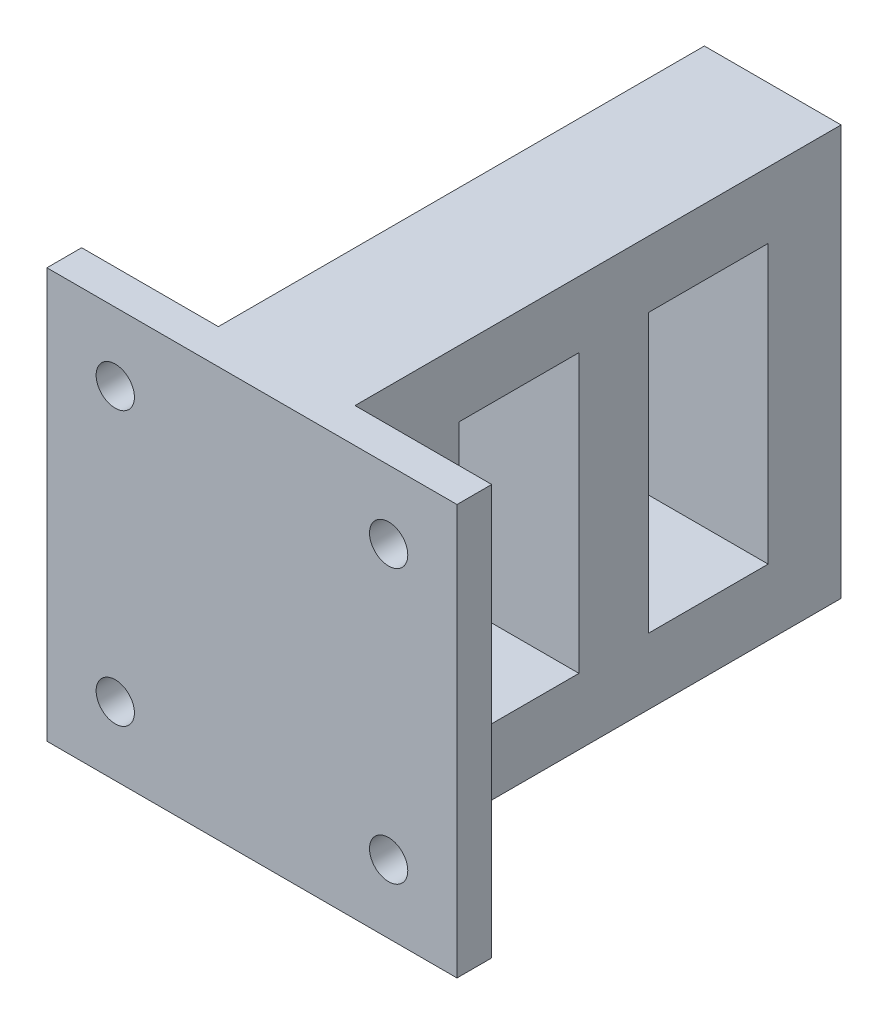
ISO-10303-21;
HEADER;
FILE_DESCRIPTION(('STEP AP214'),'2;1');
FILE_NAME('part.step','',(''),(''),'','','');
FILE_SCHEMA(('AUTOMOTIVE_DESIGN { 1 0 10303 214 1 1 1 1 }'));
ENDSEC;
DATA;
#1=APPLICATION_CONTEXT('core data for automotive mechanical design processes');
#2=APPLICATION_PROTOCOL_DEFINITION('international standard','automotive_design',2000,#1);
#3=PRODUCT_CONTEXT('',#1,'mechanical');
#4=PRODUCT('Part','Part','',(#3));
#5=PRODUCT_RELATED_PRODUCT_CATEGORY('part','',(#4));
#6=PRODUCT_DEFINITION_FORMATION('','',#4);
#7=PRODUCT_DEFINITION_CONTEXT('part definition',#1,'design');
#8=PRODUCT_DEFINITION('design','',#6,#7);
#9=PRODUCT_DEFINITION_SHAPE('','',#8);
#10=(LENGTH_UNIT() NAMED_UNIT(*) SI_UNIT(.MILLI.,.METRE.));
#11=(NAMED_UNIT(*) PLANE_ANGLE_UNIT() SI_UNIT($,.RADIAN.));
#12=(NAMED_UNIT(*) SI_UNIT($,.STERADIAN.) SOLID_ANGLE_UNIT());
#13=UNCERTAINTY_MEASURE_WITH_UNIT(LENGTH_MEASURE(1.E-05),#10,'distance_accuracy_value','');
#14=(GEOMETRIC_REPRESENTATION_CONTEXT(3) GLOBAL_UNCERTAINTY_ASSIGNED_CONTEXT((#13)) GLOBAL_UNIT_ASSIGNED_CONTEXT((#10,
#11,#12)) REPRESENTATION_CONTEXT('',''));
#15=CARTESIAN_POINT('',(0.,0.,0.));
#16=DIRECTION('',(0.,0.,1.));
#17=DIRECTION('',(1.,0.,0.));
#18=AXIS2_PLACEMENT_3D('',#15,#16,#17);
#19=CARTESIAN_POINT('',(0.,0.,0.));
#20=DIRECTION('',(0.,0.,-1.));
#21=DIRECTION('',(-1.,0.,0.));
#22=AXIS2_PLACEMENT_3D('',#19,#20,#21);
#23=PLANE('',#22);
#24=DIRECTION('',(0.,1.,0.));
#25=VECTOR('',#24,1.);
#26=CARTESIAN_POINT('',(10.,0.,0.));
#27=LINE('',#26,#25);
#28=CARTESIAN_POINT('',(10.,0.,0.));
#29=VERTEX_POINT('',#28);
#30=CARTESIAN_POINT('',(10.,30.,0.));
#31=VERTEX_POINT('',#30);
#32=EDGE_CURVE('E177',#29,#31,#27,.T.);
#33=ORIENTED_EDGE('',*,*,#32,.F.);
#34=DIRECTION('',(1.,0.,0.));
#35=VECTOR('',#34,1.);
#36=CARTESIAN_POINT('',(0.,0.,0.));
#37=LINE('',#36,#35);
#38=CARTESIAN_POINT('',(0.,0.,0.));
#39=VERTEX_POINT('',#38);
#40=EDGE_CURVE('E263',#39,#29,#37,.T.);
#41=ORIENTED_EDGE('',*,*,#40,.F.);
#42=DIRECTION('',(0.,-1.,0.));
#43=VECTOR('',#42,1.);
#44=CARTESIAN_POINT('',(0.,0.,0.));
#45=LINE('',#44,#43);
#46=CARTESIAN_POINT('',(0.,30.,0.));
#47=VERTEX_POINT('',#46);
#48=EDGE_CURVE('E246',#47,#39,#45,.T.);
#49=ORIENTED_EDGE('',*,*,#48,.F.);
#50=DIRECTION('',(-1.,0.,0.));
#51=VECTOR('',#50,1.);
#52=CARTESIAN_POINT('',(0.,30.,0.));
#53=LINE('',#52,#51);
#54=EDGE_CURVE('E268',#31,#47,#53,.T.);
#55=ORIENTED_EDGE('',*,*,#54,.F.);
#56=EDGE_LOOP('',(#33,#41,#49,#55));
#57=FACE_BOUND('',#56,.T.);
#58=CARTESIAN_POINT('',(5.,5.,0.));
#59=DIRECTION('',(0.,0.,1.));
#60=DIRECTION('',(1.,0.,0.));
#61=AXIS2_PLACEMENT_3D('',#58,#59,#60);
#62=CIRCLE('',#61,1.4);
#63=CARTESIAN_POINT('',(6.4,5.,0.));
#64=VERTEX_POINT('',#63);
#65=EDGE_CURVE('E240',#64,#64,#62,.T.);
#66=ORIENTED_EDGE('',*,*,#65,.T.);
#67=EDGE_LOOP('',(#66));
#68=FACE_BOUND('',#67,.T.);
#69=CARTESIAN_POINT('',(5.,25.,0.));
#70=DIRECTION('',(0.,0.,1.));
#71=DIRECTION('',(1.,0.,0.));
#72=AXIS2_PLACEMENT_3D('',#69,#70,#71);
#73=CIRCLE('',#72,1.4);
#74=CARTESIAN_POINT('',(6.4,25.,0.));
#75=VERTEX_POINT('',#74);
#76=EDGE_CURVE('E228',#75,#75,#73,.T.);
#77=ORIENTED_EDGE('',*,*,#76,.T.);
#78=EDGE_LOOP('',(#77));
#79=FACE_BOUND('',#78,.T.);
#80=ADVANCED_FACE('F33',(#57,#68,#79),#23,.T.);
#81=CARTESIAN_POINT('',(0.,0.,2.54));
#82=DIRECTION('',(0.,0.,-1.));
#83=DIRECTION('',(-1.,0.,0.));
#84=AXIS2_PLACEMENT_3D('',#81,#82,#83);
#85=PLANE('',#84);
#86=DIRECTION('',(0.,-1.,0.));
#87=VECTOR('',#86,1.);
#88=CARTESIAN_POINT('',(0.,0.,2.54));
#89=LINE('',#88,#87);
#90=CARTESIAN_POINT('',(0.,30.,2.54));
#91=VERTEX_POINT('',#90);
#92=CARTESIAN_POINT('',(0.,0.,2.54));
#93=VERTEX_POINT('',#92);
#94=EDGE_CURVE('E249',#91,#93,#89,.T.);
#95=ORIENTED_EDGE('',*,*,#94,.T.);
#96=DIRECTION('',(1.,0.,0.));
#97=VECTOR('',#96,1.);
#98=CARTESIAN_POINT('',(0.,0.,2.54));
#99=LINE('',#98,#97);
#100=CARTESIAN_POINT('',(30.,0.,2.54));
#101=VERTEX_POINT('',#100);
#102=EDGE_CURVE('E252',#93,#101,#99,.T.);
#103=ORIENTED_EDGE('',*,*,#102,.T.);
#104=DIRECTION('',(0.,1.,0.));
#105=VECTOR('',#104,1.);
#106=CARTESIAN_POINT('',(30.,0.,2.54));
#107=LINE('',#106,#105);
#108=CARTESIAN_POINT('',(30.,30.,2.54));
#109=VERTEX_POINT('',#108);
#110=EDGE_CURVE('E255',#101,#109,#107,.T.);
#111=ORIENTED_EDGE('',*,*,#110,.T.);
#112=DIRECTION('',(-1.,0.,0.));
#113=VECTOR('',#112,1.);
#114=CARTESIAN_POINT('',(0.,30.,2.54));
#115=LINE('',#114,#113);
#116=EDGE_CURVE('E257',#109,#91,#115,.T.);
#117=ORIENTED_EDGE('',*,*,#116,.T.);
#118=EDGE_LOOP('',(#95,#103,#111,#117));
#119=FACE_BOUND('',#118,.T.);
#120=CARTESIAN_POINT('',(5.,5.,2.54));
#121=DIRECTION('',(0.,0.,1.));
#122=DIRECTION('',(1.,0.,0.));
#123=AXIS2_PLACEMENT_3D('',#120,#121,#122);
#124=CIRCLE('',#123,1.4);
#125=CARTESIAN_POINT('',(6.4,5.,2.54));
#126=VERTEX_POINT('',#125);
#127=EDGE_CURVE('E243',#126,#126,#124,.T.);
#128=ORIENTED_EDGE('',*,*,#127,.F.);
#129=EDGE_LOOP('',(#128));
#130=FACE_BOUND('',#129,.T.);
#131=CARTESIAN_POINT('',(25.,5.,2.54));
#132=DIRECTION('',(0.,0.,1.));
#133=DIRECTION('',(1.,0.,0.));
#134=AXIS2_PLACEMENT_3D('',#131,#132,#133);
#135=CIRCLE('',#134,1.4);
#136=CARTESIAN_POINT('',(26.4,5.,2.54));
#137=VERTEX_POINT('',#136);
#138=EDGE_CURVE('E237',#137,#137,#135,.T.);
#139=ORIENTED_EDGE('',*,*,#138,.F.);
#140=EDGE_LOOP('',(#139));
#141=FACE_BOUND('',#140,.T.);
#142=CARTESIAN_POINT('',(5.,25.,2.54));
#143=DIRECTION('',(0.,0.,1.));
#144=DIRECTION('',(1.,0.,0.));
#145=AXIS2_PLACEMENT_3D('',#142,#143,#144);
#146=CIRCLE('',#145,1.4);
#147=CARTESIAN_POINT('',(6.4,25.,2.54));
#148=VERTEX_POINT('',#147);
#149=EDGE_CURVE('E231',#148,#148,#146,.T.);
#150=ORIENTED_EDGE('',*,*,#149,.F.);
#151=EDGE_LOOP('',(#150));
#152=FACE_BOUND('',#151,.T.);
#153=CARTESIAN_POINT('',(25.,25.,2.54));
#154=DIRECTION('',(0.,0.,1.));
#155=DIRECTION('',(1.,0.,0.));
#156=AXIS2_PLACEMENT_3D('',#153,#154,#155);
#157=CIRCLE('',#156,1.4);
#158=CARTESIAN_POINT('',(26.4,25.,2.54));
#159=VERTEX_POINT('',#158);
#160=EDGE_CURVE('E225',#159,#159,#157,.T.);
#161=ORIENTED_EDGE('',*,*,#160,.F.);
#162=EDGE_LOOP('',(#161));
#163=FACE_BOUND('',#162,.T.);
#164=ADVANCED_FACE('F318',(#119,#130,#141,#152,#163),#85,.F.);
#165=DIRECTION('',(0.,-1.,0.));
#166=VECTOR('',#165,1.);
#167=CARTESIAN_POINT('',(20.,0.,0.));
#168=LINE('',#167,#166);
#169=CARTESIAN_POINT('',(20.,30.,0.));
#170=VERTEX_POINT('',#169);
#171=CARTESIAN_POINT('',(20.,0.,0.));
#172=VERTEX_POINT('',#171);
#173=EDGE_CURVE('E202',#170,#172,#168,.T.);
#174=ORIENTED_EDGE('',*,*,#173,.F.);
#175=CARTESIAN_POINT('',(30.,30.,0.));
#176=VERTEX_POINT('',#175);
#177=EDGE_CURVE('E253',#176,#170,#53,.T.);
#178=ORIENTED_EDGE('',*,*,#177,.F.);
#179=DIRECTION('',(0.,1.,0.));
#180=VECTOR('',#179,1.);
#181=CARTESIAN_POINT('',(30.,0.,0.));
#182=LINE('',#181,#180);
#183=CARTESIAN_POINT('',(30.,0.,0.));
#184=VERTEX_POINT('',#183);
#185=EDGE_CURVE('E266',#184,#176,#182,.T.);
#186=ORIENTED_EDGE('',*,*,#185,.F.);
#187=EDGE_CURVE('E262',#172,#184,#37,.T.);
#188=ORIENTED_EDGE('',*,*,#187,.F.);
#189=EDGE_LOOP('',(#174,#178,#186,#188));
#190=FACE_BOUND('',#189,.T.);
#191=CARTESIAN_POINT('',(25.,5.,0.));
#192=DIRECTION('',(0.,0.,1.));
#193=DIRECTION('',(1.,0.,0.));
#194=AXIS2_PLACEMENT_3D('',#191,#192,#193);
#195=CIRCLE('',#194,1.4);
#196=CARTESIAN_POINT('',(26.4,5.,0.));
#197=VERTEX_POINT('',#196);
#198=EDGE_CURVE('E234',#197,#197,#195,.T.);
#199=ORIENTED_EDGE('',*,*,#198,.T.);
#200=EDGE_LOOP('',(#199));
#201=FACE_BOUND('',#200,.T.);
#202=CARTESIAN_POINT('',(25.,25.,0.));
#203=DIRECTION('',(0.,0.,1.));
#204=DIRECTION('',(1.,0.,0.));
#205=AXIS2_PLACEMENT_3D('',#202,#203,#204);
#206=CIRCLE('',#205,1.4);
#207=CARTESIAN_POINT('',(26.4,25.,0.));
#208=VERTEX_POINT('',#207);
#209=EDGE_CURVE('E224',#208,#208,#206,.T.);
#210=ORIENTED_EDGE('',*,*,#209,.T.);
#211=EDGE_LOOP('',(#210));
#212=FACE_BOUND('',#211,.T.);
#213=ADVANCED_FACE('F321',(#190,#201,#212),#23,.T.);
#214=CARTESIAN_POINT('',(0.,0.,2.54));
#215=DIRECTION('',(1.,0.,0.));
#216=DIRECTION('',(0.,0.,-1.));
#217=AXIS2_PLACEMENT_3D('',#214,#215,#216);
#218=PLANE('',#217);
#219=ORIENTED_EDGE('',*,*,#48,.T.);
#220=DIRECTION('',(0.,0.,-1.));
#221=VECTOR('',#220,1.);
#222=CARTESIAN_POINT('',(0.,0.,2.54));
#223=LINE('',#222,#221);
#224=EDGE_CURVE('E279',#93,#39,#223,.T.);
#225=ORIENTED_EDGE('',*,*,#224,.F.);
#226=ORIENTED_EDGE('',*,*,#94,.F.);
#227=DIRECTION('',(0.,0.,-1.));
#228=VECTOR('',#227,1.);
#229=CARTESIAN_POINT('',(0.,30.,2.54));
#230=LINE('',#229,#228);
#231=EDGE_CURVE('E259',#91,#47,#230,.T.);
#232=ORIENTED_EDGE('',*,*,#231,.T.);
#233=EDGE_LOOP('',(#219,#225,#226,#232));
#234=FACE_BOUND('',#233,.T.);
#235=ADVANCED_FACE('F35',(#234),#218,.F.);
#236=CARTESIAN_POINT('',(0.,0.,2.54));
#237=DIRECTION('',(0.,1.,0.));
#238=DIRECTION('',(0.,0.,1.));
#239=AXIS2_PLACEMENT_3D('',#236,#237,#238);
#240=PLANE('',#239);
#241=ORIENTED_EDGE('',*,*,#40,.T.);
#242=DIRECTION('',(0.,0.,1.));
#243=VECTOR('',#242,1.);
#244=CARTESIAN_POINT('',(10.,0.,-35.56));
#245=LINE('',#244,#243);
#246=CARTESIAN_POINT('',(10.,0.,-35.56));
#247=VERTEX_POINT('',#246);
#248=EDGE_CURVE('E208',#247,#29,#245,.T.);
#249=ORIENTED_EDGE('',*,*,#248,.F.);
#250=DIRECTION('',(-1.,0.,0.));
#251=VECTOR('',#250,1.);
#252=CARTESIAN_POINT('',(10.,0.,-35.56));
#253=LINE('',#252,#251);
#254=CARTESIAN_POINT('',(20.,0.,-35.56));
#255=VERTEX_POINT('',#254);
#256=EDGE_CURVE('E206',#255,#247,#253,.T.);
#257=ORIENTED_EDGE('',*,*,#256,.F.);
#258=DIRECTION('',(0.,0.,1.));
#259=VECTOR('',#258,1.);
#260=CARTESIAN_POINT('',(20.,0.,-35.56));
#261=LINE('',#260,#259);
#262=EDGE_CURVE('E215',#255,#172,#261,.T.);
#263=ORIENTED_EDGE('',*,*,#262,.T.);
#264=ORIENTED_EDGE('',*,*,#187,.T.);
#265=DIRECTION('',(0.,0.,-1.));
#266=VECTOR('',#265,1.);
#267=CARTESIAN_POINT('',(30.,0.,2.54));
#268=LINE('',#267,#266);
#269=EDGE_CURVE('E276',#101,#184,#268,.T.);
#270=ORIENTED_EDGE('',*,*,#269,.F.);
#271=ORIENTED_EDGE('',*,*,#102,.F.);
#272=ORIENTED_EDGE('',*,*,#224,.T.);
#273=EDGE_LOOP('',(#241,#249,#257,#263,#264,#270,#271,#272));
#274=FACE_BOUND('',#273,.T.);
#275=ADVANCED_FACE('F334',(#274),#240,.F.);
#276=CARTESIAN_POINT('',(30.,0.,2.54));
#277=DIRECTION('',(-1.,0.,0.));
#278=DIRECTION('',(0.,0.,1.));
#279=AXIS2_PLACEMENT_3D('',#276,#277,#278);
#280=PLANE('',#279);
#281=ORIENTED_EDGE('',*,*,#185,.T.);
#282=DIRECTION('',(0.,0.,-1.));
#283=VECTOR('',#282,1.);
#284=CARTESIAN_POINT('',(30.,30.,2.54));
#285=LINE('',#284,#283);
#286=EDGE_CURVE('E273',#109,#176,#285,.T.);
#287=ORIENTED_EDGE('',*,*,#286,.F.);
#288=ORIENTED_EDGE('',*,*,#110,.F.);
#289=ORIENTED_EDGE('',*,*,#269,.T.);
#290=EDGE_LOOP('',(#281,#287,#288,#289));
#291=FACE_BOUND('',#290,.T.);
#292=ADVANCED_FACE('F367',(#291),#280,.F.);
#293=CARTESIAN_POINT('',(0.,30.,2.54));
#294=DIRECTION('',(0.,-1.,0.));
#295=DIRECTION('',(0.,0.,-1.));
#296=AXIS2_PLACEMENT_3D('',#293,#294,#295);
#297=PLANE('',#296);
#298=ORIENTED_EDGE('',*,*,#177,.T.);
#299=DIRECTION('',(0.,0.,1.));
#300=VECTOR('',#299,1.);
#301=CARTESIAN_POINT('',(20.,30.,-35.56));
#302=LINE('',#301,#300);
#303=CARTESIAN_POINT('',(20.,30.,-35.56));
#304=VERTEX_POINT('',#303);
#305=EDGE_CURVE('E218',#304,#170,#302,.T.);
#306=ORIENTED_EDGE('',*,*,#305,.F.);
#307=DIRECTION('',(1.,0.,0.));
#308=VECTOR('',#307,1.);
#309=CARTESIAN_POINT('',(10.,30.,-35.56));
#310=LINE('',#309,#308);
#311=CARTESIAN_POINT('',(10.,30.,-35.56));
#312=VERTEX_POINT('',#311);
#313=EDGE_CURVE('E201',#312,#304,#310,.T.);
#314=ORIENTED_EDGE('',*,*,#313,.F.);
#315=DIRECTION('',(0.,0.,1.));
#316=VECTOR('',#315,1.);
#317=CARTESIAN_POINT('',(10.,30.,-35.56));
#318=LINE('',#317,#316);
#319=EDGE_CURVE('E221',#312,#31,#318,.T.);
#320=ORIENTED_EDGE('',*,*,#319,.T.);
#321=ORIENTED_EDGE('',*,*,#54,.T.);
#322=ORIENTED_EDGE('',*,*,#231,.F.);
#323=ORIENTED_EDGE('',*,*,#116,.F.);
#324=ORIENTED_EDGE('',*,*,#286,.T.);
#325=EDGE_LOOP('',(#298,#306,#314,#320,#321,#322,#323,#324));
#326=FACE_BOUND('',#325,.T.);
#327=ADVANCED_FACE('F362',(#326),#297,.F.);
#328=CARTESIAN_POINT('',(5.,5.,2.54));
#329=DIRECTION('',(0.,0.,-1.));
#330=DIRECTION('',(-1.,0.,0.));
#331=AXIS2_PLACEMENT_3D('',#328,#329,#330);
#332=CYLINDRICAL_SURFACE('',#331,1.4);
#333=ORIENTED_EDGE('',*,*,#127,.T.);
#334=EDGE_LOOP('',(#333));
#335=FACE_BOUND('',#334,.T.);
#336=ORIENTED_EDGE('',*,*,#65,.F.);
#337=EDGE_LOOP('',(#336));
#338=FACE_BOUND('',#337,.T.);
#339=ADVANCED_FACE('F359',(#335,#338),#332,.F.);
#340=CARTESIAN_POINT('',(25.,5.,2.54));
#341=DIRECTION('',(0.,0.,-1.));
#342=DIRECTION('',(-1.,0.,0.));
#343=AXIS2_PLACEMENT_3D('',#340,#341,#342);
#344=CYLINDRICAL_SURFACE('',#343,1.4);
#345=ORIENTED_EDGE('',*,*,#138,.T.);
#346=EDGE_LOOP('',(#345));
#347=FACE_BOUND('',#346,.T.);
#348=ORIENTED_EDGE('',*,*,#198,.F.);
#349=EDGE_LOOP('',(#348));
#350=FACE_BOUND('',#349,.T.);
#351=ADVANCED_FACE('F352',(#347,#350),#344,.F.);
#352=CARTESIAN_POINT('',(5.,25.,2.54));
#353=DIRECTION('',(0.,0.,-1.));
#354=DIRECTION('',(-1.,0.,0.));
#355=AXIS2_PLACEMENT_3D('',#352,#353,#354);
#356=CYLINDRICAL_SURFACE('',#355,1.4);
#357=ORIENTED_EDGE('',*,*,#149,.T.);
#358=EDGE_LOOP('',(#357));
#359=FACE_BOUND('',#358,.T.);
#360=ORIENTED_EDGE('',*,*,#76,.F.);
#361=EDGE_LOOP('',(#360));
#362=FACE_BOUND('',#361,.T.);
#363=ADVANCED_FACE('F344',(#359,#362),#356,.F.);
#364=CARTESIAN_POINT('',(25.,25.,2.54));
#365=DIRECTION('',(0.,0.,-1.));
#366=DIRECTION('',(-1.,0.,0.));
#367=AXIS2_PLACEMENT_3D('',#364,#365,#366);
#368=CYLINDRICAL_SURFACE('',#367,1.4);
#369=ORIENTED_EDGE('',*,*,#160,.T.);
#370=EDGE_LOOP('',(#369));
#371=FACE_BOUND('',#370,.T.);
#372=ORIENTED_EDGE('',*,*,#209,.F.);
#373=EDGE_LOOP('',(#372));
#374=FACE_BOUND('',#373,.T.);
#375=ADVANCED_FACE('F342',(#371,#374),#368,.F.);
#376=CARTESIAN_POINT('',(10.,0.,-35.56));
#377=DIRECTION('',(1.,0.,0.));
#378=DIRECTION('',(0.,0.,-1.));
#379=AXIS2_PLACEMENT_3D('',#376,#377,#378);
#380=PLANE('',#379);
#381=DIRECTION('',(0.,0.,1.));
#382=VECTOR('',#381,1.);
#383=CARTESIAN_POINT('',(10.,4.84,-30.226));
#384=LINE('',#383,#382);
#385=CARTESIAN_POINT('',(10.,4.84,-30.226));
#386=VERTEX_POINT('',#385);
#387=CARTESIAN_POINT('',(10.,4.84,-21.463));
#388=VERTEX_POINT('',#387);
#389=EDGE_CURVE('E163',#386,#388,#384,.T.);
#390=ORIENTED_EDGE('',*,*,#389,.F.);
#391=DIRECTION('',(0.,-1.,0.));
#392=VECTOR('',#391,1.);
#393=CARTESIAN_POINT('',(10.,4.84,-30.226));
#394=LINE('',#393,#392);
#395=CARTESIAN_POINT('',(10.,25.16,-30.226));
#396=VERTEX_POINT('',#395);
#397=EDGE_CURVE('E48',#396,#386,#394,.T.);
#398=ORIENTED_EDGE('',*,*,#397,.F.);
#399=DIRECTION('',(0.,0.,-1.));
#400=VECTOR('',#399,1.);
#401=CARTESIAN_POINT('',(10.,25.16,-30.226));
#402=LINE('',#401,#400);
#403=CARTESIAN_POINT('',(10.,25.16,-21.463));
#404=VERTEX_POINT('',#403);
#405=EDGE_CURVE('E170',#404,#396,#402,.T.);
#406=ORIENTED_EDGE('',*,*,#405,.F.);
#407=DIRECTION('',(0.,1.,0.));
#408=VECTOR('',#407,1.);
#409=CARTESIAN_POINT('',(10.,4.84,-21.463));
#410=LINE('',#409,#408);
#411=EDGE_CURVE('E153',#388,#404,#410,.T.);
#412=ORIENTED_EDGE('',*,*,#411,.F.);
#413=EDGE_LOOP('',(#390,#398,#406,#412));
#414=FACE_BOUND('',#413,.T.);
#415=DIRECTION('',(0.,0.,1.));
#416=VECTOR('',#415,1.);
#417=CARTESIAN_POINT('',(10.,4.84,-16.383));
#418=LINE('',#417,#416);
#419=CARTESIAN_POINT('',(10.,4.84,-16.383));
#420=VERTEX_POINT('',#419);
#421=CARTESIAN_POINT('',(10.,4.84,-7.62));
#422=VERTEX_POINT('',#421);
#423=EDGE_CURVE('E181',#420,#422,#418,.T.);
#424=ORIENTED_EDGE('',*,*,#423,.F.);
#425=DIRECTION('',(0.,-1.,0.));
#426=VECTOR('',#425,1.);
#427=CARTESIAN_POINT('',(10.,4.84,-16.383));
#428=LINE('',#427,#426);
#429=CARTESIAN_POINT('',(10.,25.16,-16.383));
#430=VERTEX_POINT('',#429);
#431=EDGE_CURVE('E56',#430,#420,#428,.T.);
#432=ORIENTED_EDGE('',*,*,#431,.F.);
#433=DIRECTION('',(0.,0.,-1.));
#434=VECTOR('',#433,1.);
#435=CARTESIAN_POINT('',(10.,25.16,-16.383));
#436=LINE('',#435,#434);
#437=CARTESIAN_POINT('',(10.,25.16,-7.62));
#438=VERTEX_POINT('',#437);
#439=EDGE_CURVE('E187',#438,#430,#436,.T.);
#440=ORIENTED_EDGE('',*,*,#439,.F.);
#441=DIRECTION('',(0.,1.,0.));
#442=VECTOR('',#441,1.);
#443=CARTESIAN_POINT('',(10.,4.84,-7.62));
#444=LINE('',#443,#442);
#445=EDGE_CURVE('E184',#422,#438,#444,.T.);
#446=ORIENTED_EDGE('',*,*,#445,.F.);
#447=EDGE_LOOP('',(#424,#432,#440,#446));
#448=FACE_BOUND('',#447,.T.);
#449=ORIENTED_EDGE('',*,*,#32,.T.);
#450=ORIENTED_EDGE('',*,*,#319,.F.);
#451=DIRECTION('',(0.,1.,0.));
#452=VECTOR('',#451,1.);
#453=CARTESIAN_POINT('',(10.,0.,-35.56));
#454=LINE('',#453,#452);
#455=EDGE_CURVE('E198',#247,#312,#454,.T.);
#456=ORIENTED_EDGE('',*,*,#455,.F.);
#457=ORIENTED_EDGE('',*,*,#248,.T.);
#458=EDGE_LOOP('',(#449,#450,#456,#457));
#459=FACE_BOUND('',#458,.T.);
#460=ADVANCED_FACE('F167',(#414,#448,#459),#380,.F.);
#461=CARTESIAN_POINT('',(20.,0.,-35.56));
#462=DIRECTION('',(-1.,0.,0.));
#463=DIRECTION('',(0.,0.,1.));
#464=AXIS2_PLACEMENT_3D('',#461,#462,#463);
#465=PLANE('',#464);
#466=DIRECTION('',(0.,0.,-1.));
#467=VECTOR('',#466,1.);
#468=CARTESIAN_POINT('',(20.,25.16,-35.56));
#469=LINE('',#468,#467);
#470=CARTESIAN_POINT('',(20.,25.16,-21.463));
#471=VERTEX_POINT('',#470);
#472=CARTESIAN_POINT('',(20.,25.16,-30.226));
#473=VERTEX_POINT('',#472);
#474=EDGE_CURVE('E41',#471,#473,#469,.T.);
#475=ORIENTED_EDGE('',*,*,#474,.T.);
#476=DIRECTION('',(0.,-1.,0.));
#477=VECTOR('',#476,1.);
#478=CARTESIAN_POINT('',(20.,0.,-30.226));
#479=LINE('',#478,#477);
#480=CARTESIAN_POINT('',(20.,4.84,-30.226));
#481=VERTEX_POINT('',#480);
#482=EDGE_CURVE('E11',#473,#481,#479,.T.);
#483=ORIENTED_EDGE('',*,*,#482,.T.);
#484=DIRECTION('',(0.,0.,1.));
#485=VECTOR('',#484,1.);
#486=CARTESIAN_POINT('',(20.,4.84,-35.56));
#487=LINE('',#486,#485);
#488=CARTESIAN_POINT('',(20.,4.84,-21.463));
#489=VERTEX_POINT('',#488);
#490=EDGE_CURVE('E294',#481,#489,#487,.T.);
#491=ORIENTED_EDGE('',*,*,#490,.T.);
#492=DIRECTION('',(0.,1.,0.));
#493=VECTOR('',#492,1.);
#494=CARTESIAN_POINT('',(20.,0.,-21.463));
#495=LINE('',#494,#493);
#496=EDGE_CURVE('E156',#489,#471,#495,.T.);
#497=ORIENTED_EDGE('',*,*,#496,.T.);
#498=EDGE_LOOP('',(#475,#483,#491,#497));
#499=FACE_BOUND('',#498,.T.);
#500=DIRECTION('',(0.,0.,-1.));
#501=VECTOR('',#500,1.);
#502=CARTESIAN_POINT('',(20.,25.16,-35.56));
#503=LINE('',#502,#501);
#504=CARTESIAN_POINT('',(20.,25.16,-7.62));
#505=VERTEX_POINT('',#504);
#506=CARTESIAN_POINT('',(20.,25.16,-16.383));
#507=VERTEX_POINT('',#506);
#508=EDGE_CURVE('E288',#505,#507,#503,.T.);
#509=ORIENTED_EDGE('',*,*,#508,.T.);
#510=DIRECTION('',(0.,-1.,0.));
#511=VECTOR('',#510,1.);
#512=CARTESIAN_POINT('',(20.,0.,-16.383));
#513=LINE('',#512,#511);
#514=CARTESIAN_POINT('',(20.,4.84,-16.383));
#515=VERTEX_POINT('',#514);
#516=EDGE_CURVE('E291',#507,#515,#513,.T.);
#517=ORIENTED_EDGE('',*,*,#516,.T.);
#518=DIRECTION('',(0.,0.,1.));
#519=VECTOR('',#518,1.);
#520=CARTESIAN_POINT('',(20.,4.84,-35.56));
#521=LINE('',#520,#519);
#522=CARTESIAN_POINT('',(20.,4.84,-7.62));
#523=VERTEX_POINT('',#522);
#524=EDGE_CURVE('E282',#515,#523,#521,.T.);
#525=ORIENTED_EDGE('',*,*,#524,.T.);
#526=DIRECTION('',(0.,1.,0.));
#527=VECTOR('',#526,1.);
#528=CARTESIAN_POINT('',(20.,0.,-7.62));
#529=LINE('',#528,#527);
#530=EDGE_CURVE('E285',#523,#505,#529,.T.);
#531=ORIENTED_EDGE('',*,*,#530,.T.);
#532=EDGE_LOOP('',(#509,#517,#525,#531));
#533=FACE_BOUND('',#532,.T.);
#534=ORIENTED_EDGE('',*,*,#173,.T.);
#535=ORIENTED_EDGE('',*,*,#262,.F.);
#536=DIRECTION('',(0.,-1.,0.));
#537=VECTOR('',#536,1.);
#538=CARTESIAN_POINT('',(20.,0.,-35.56));
#539=LINE('',#538,#537);
#540=EDGE_CURVE('E204',#304,#255,#539,.T.);
#541=ORIENTED_EDGE('',*,*,#540,.F.);
#542=ORIENTED_EDGE('',*,*,#305,.T.);
#543=EDGE_LOOP('',(#534,#535,#541,#542));
#544=FACE_BOUND('',#543,.T.);
#545=ADVANCED_FACE('F298',(#499,#533,#544),#465,.F.);
#546=CARTESIAN_POINT('',(0.,0.,-35.56));
#547=DIRECTION('',(0.,0.,-1.));
#548=DIRECTION('',(-1.,0.,0.));
#549=AXIS2_PLACEMENT_3D('',#546,#547,#548);
#550=PLANE('',#549);
#551=ORIENTED_EDGE('',*,*,#455,.T.);
#552=ORIENTED_EDGE('',*,*,#313,.T.);
#553=ORIENTED_EDGE('',*,*,#540,.T.);
#554=ORIENTED_EDGE('',*,*,#256,.T.);
#555=EDGE_LOOP('',(#551,#552,#553,#554));
#556=FACE_BOUND('',#555,.T.);
#557=ADVANCED_FACE('F400',(#556),#550,.T.);
#558=CARTESIAN_POINT('',(45.56,4.84,-16.383));
#559=DIRECTION('',(0.,0.,-1.));
#560=DIRECTION('',(-1.,0.,0.));
#561=AXIS2_PLACEMENT_3D('',#558,#559,#560);
#562=PLANE('',#561);
#563=DIRECTION('',(-1.,0.,0.));
#564=VECTOR('',#563,1.);
#565=CARTESIAN_POINT('',(45.56,25.16,-16.383));
#566=LINE('',#565,#564);
#567=EDGE_CURVE('E191',#507,#430,#566,.T.);
#568=ORIENTED_EDGE('',*,*,#567,.T.);
#569=ORIENTED_EDGE('',*,*,#431,.T.);
#570=DIRECTION('',(-1.,0.,0.));
#571=VECTOR('',#570,1.);
#572=CARTESIAN_POINT('',(45.56,4.84,-16.383));
#573=LINE('',#572,#571);
#574=EDGE_CURVE('E190',#515,#420,#573,.T.);
#575=ORIENTED_EDGE('',*,*,#574,.F.);
#576=ORIENTED_EDGE('',*,*,#516,.F.);
#577=EDGE_LOOP('',(#568,#569,#575,#576));
#578=FACE_BOUND('',#577,.T.);
#579=ADVANCED_FACE('F416',(#578),#562,.F.);
#580=CARTESIAN_POINT('',(45.56,25.16,-16.383));
#581=DIRECTION('',(0.,1.,0.));
#582=DIRECTION('',(0.,0.,1.));
#583=AXIS2_PLACEMENT_3D('',#580,#581,#582);
#584=PLANE('',#583);
#585=DIRECTION('',(-1.,0.,0.));
#586=VECTOR('',#585,1.);
#587=CARTESIAN_POINT('',(45.56,25.16,-7.62));
#588=LINE('',#587,#586);
#589=EDGE_CURVE('E193',#505,#438,#588,.T.);
#590=ORIENTED_EDGE('',*,*,#589,.T.);
#591=ORIENTED_EDGE('',*,*,#439,.T.);
#592=ORIENTED_EDGE('',*,*,#567,.F.);
#593=ORIENTED_EDGE('',*,*,#508,.F.);
#594=EDGE_LOOP('',(#590,#591,#592,#593));
#595=FACE_BOUND('',#594,.T.);
#596=ADVANCED_FACE('F420',(#595),#584,.F.);
#597=CARTESIAN_POINT('',(45.56,4.84,-7.62));
#598=DIRECTION('',(0.,0.,1.));
#599=DIRECTION('',(1.,0.,0.));
#600=AXIS2_PLACEMENT_3D('',#597,#598,#599);
#601=PLANE('',#600);
#602=DIRECTION('',(-1.,0.,0.));
#603=VECTOR('',#602,1.);
#604=CARTESIAN_POINT('',(45.56,4.84,-7.62));
#605=LINE('',#604,#603);
#606=EDGE_CURVE('E195',#523,#422,#605,.T.);
#607=ORIENTED_EDGE('',*,*,#606,.T.);
#608=ORIENTED_EDGE('',*,*,#445,.T.);
#609=ORIENTED_EDGE('',*,*,#589,.F.);
#610=ORIENTED_EDGE('',*,*,#530,.F.);
#611=EDGE_LOOP('',(#607,#608,#609,#610));
#612=FACE_BOUND('',#611,.T.);
#613=ADVANCED_FACE('F312',(#612),#601,.F.);
#614=CARTESIAN_POINT('',(45.56,4.84,-16.383));
#615=DIRECTION('',(0.,-1.,0.));
#616=DIRECTION('',(0.,0.,-1.));
#617=AXIS2_PLACEMENT_3D('',#614,#615,#616);
#618=PLANE('',#617);
#619=ORIENTED_EDGE('',*,*,#574,.T.);
#620=ORIENTED_EDGE('',*,*,#423,.T.);
#621=ORIENTED_EDGE('',*,*,#606,.F.);
#622=ORIENTED_EDGE('',*,*,#524,.F.);
#623=EDGE_LOOP('',(#619,#620,#621,#622));
#624=FACE_BOUND('',#623,.T.);
#625=ADVANCED_FACE('F305',(#624),#618,.F.);
#626=CARTESIAN_POINT('',(45.56,4.84,-30.226));
#627=DIRECTION('',(0.,0.,-1.));
#628=DIRECTION('',(-1.,0.,0.));
#629=AXIS2_PLACEMENT_3D('',#626,#627,#628);
#630=PLANE('',#629);
#631=DIRECTION('',(-1.,0.,0.));
#632=VECTOR('',#631,1.);
#633=CARTESIAN_POINT('',(45.56,25.16,-30.226));
#634=LINE('',#633,#632);
#635=EDGE_CURVE('E175',#473,#396,#634,.T.);
#636=ORIENTED_EDGE('',*,*,#635,.T.);
#637=ORIENTED_EDGE('',*,*,#397,.T.);
#638=DIRECTION('',(-1.,0.,0.));
#639=VECTOR('',#638,1.);
#640=CARTESIAN_POINT('',(45.56,4.84,-30.226));
#641=LINE('',#640,#639);
#642=EDGE_CURVE('E160',#481,#386,#641,.T.);
#643=ORIENTED_EDGE('',*,*,#642,.F.);
#644=ORIENTED_EDGE('',*,*,#482,.F.);
#645=EDGE_LOOP('',(#636,#637,#643,#644));
#646=FACE_BOUND('',#645,.T.);
#647=ADVANCED_FACE('F303',(#646),#630,.F.);
#648=CARTESIAN_POINT('',(45.56,25.16,-30.226));
#649=DIRECTION('',(0.,1.,0.));
#650=DIRECTION('',(0.,0.,1.));
#651=AXIS2_PLACEMENT_3D('',#648,#649,#650);
#652=PLANE('',#651);
#653=DIRECTION('',(-1.,0.,0.));
#654=VECTOR('',#653,1.);
#655=CARTESIAN_POINT('',(45.56,25.16,-21.463));
#656=LINE('',#655,#654);
#657=EDGE_CURVE('E159',#471,#404,#656,.T.);
#658=ORIENTED_EDGE('',*,*,#657,.T.);
#659=ORIENTED_EDGE('',*,*,#405,.T.);
#660=ORIENTED_EDGE('',*,*,#635,.F.);
#661=ORIENTED_EDGE('',*,*,#474,.F.);
#662=EDGE_LOOP('',(#658,#659,#660,#661));
#663=FACE_BOUND('',#662,.T.);
#664=ADVANCED_FACE('F302',(#663),#652,.F.);
#665=CARTESIAN_POINT('',(45.56,4.84,-21.463));
#666=DIRECTION('',(0.,0.,1.));
#667=DIRECTION('',(0.,-1.,0.));
#668=AXIS2_PLACEMENT_3D('',#665,#666,#667);
#669=PLANE('',#668);
#670=DIRECTION('',(-1.,0.,0.));
#671=VECTOR('',#670,1.);
#672=CARTESIAN_POINT('',(45.56,4.84,-21.463));
#673=LINE('',#672,#671);
#674=EDGE_CURVE('E148',#489,#388,#673,.T.);
#675=ORIENTED_EDGE('',*,*,#674,.T.);
#676=ORIENTED_EDGE('',*,*,#411,.T.);
#677=ORIENTED_EDGE('',*,*,#657,.F.);
#678=ORIENTED_EDGE('',*,*,#496,.F.);
#679=EDGE_LOOP('',(#675,#676,#677,#678));
#680=FACE_BOUND('',#679,.T.);
#681=ADVANCED_FACE('F150',(#680),#669,.F.);
#682=CARTESIAN_POINT('',(45.56,4.84,-30.226));
#683=DIRECTION('',(0.,-1.,0.));
#684=DIRECTION('',(0.,0.,-1.));
#685=AXIS2_PLACEMENT_3D('',#682,#683,#684);
#686=PLANE('',#685);
#687=ORIENTED_EDGE('',*,*,#642,.T.);
#688=ORIENTED_EDGE('',*,*,#389,.T.);
#689=ORIENTED_EDGE('',*,*,#674,.F.);
#690=ORIENTED_EDGE('',*,*,#490,.F.);
#691=EDGE_LOOP('',(#687,#688,#689,#690));
#692=FACE_BOUND('',#691,.T.);
#693=ADVANCED_FACE('F164',(#692),#686,.F.);
#694=CLOSED_SHELL('',(#80,#164,#213,#235,#275,#292,#327,#339,#351,#363,#375,#460,#545,#557,#579,
#596,#613,#625,#647,#664,#681,#693));
#695=MANIFOLD_SOLID_BREP('B2',#694);
#696=ADVANCED_BREP_SHAPE_REPRESENTATION('',(#18,#695),#14);
#697=SHAPE_DEFINITION_REPRESENTATION(#9,#696);
ENDSEC;
END-ISO-10303-21;
